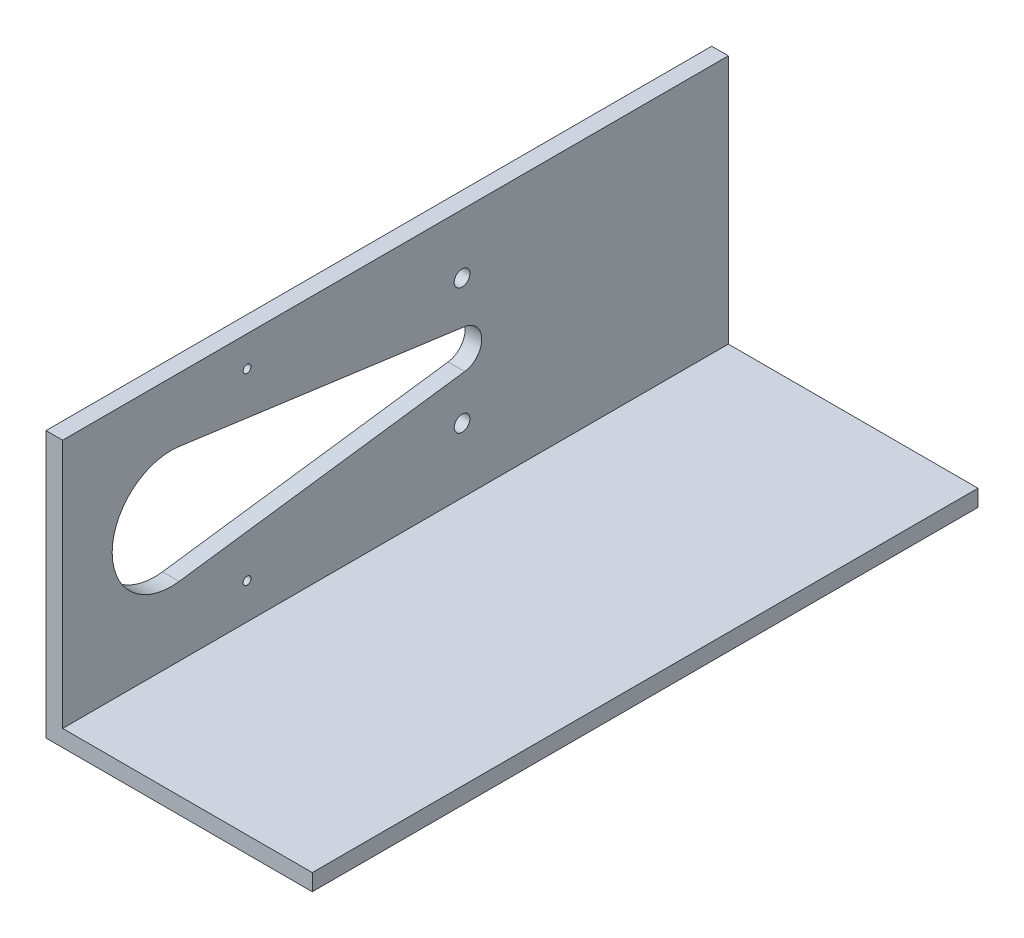
ISO-10303-21;
HEADER;
FILE_DESCRIPTION(('STEP AP214'),'2;1');
FILE_NAME('part.step','',(''),(''),'','','');
FILE_SCHEMA(('AUTOMOTIVE_DESIGN { 1 0 10303 214 1 1 1 1 }'));
ENDSEC;
DATA;
#1=APPLICATION_CONTEXT('core data for automotive mechanical design processes');
#2=APPLICATION_PROTOCOL_DEFINITION('international standard','automotive_design',2000,#1);
#3=PRODUCT_CONTEXT('',#1,'mechanical');
#4=PRODUCT('Part','Part','',(#3));
#5=PRODUCT_RELATED_PRODUCT_CATEGORY('part','',(#4));
#6=PRODUCT_DEFINITION_FORMATION('','',#4);
#7=PRODUCT_DEFINITION_CONTEXT('part definition',#1,'design');
#8=PRODUCT_DEFINITION('design','',#6,#7);
#9=PRODUCT_DEFINITION_SHAPE('','',#8);
#10=(LENGTH_UNIT() NAMED_UNIT(*) SI_UNIT(.MILLI.,.METRE.));
#11=(NAMED_UNIT(*) PLANE_ANGLE_UNIT() SI_UNIT($,.RADIAN.));
#12=(NAMED_UNIT(*) SI_UNIT($,.STERADIAN.) SOLID_ANGLE_UNIT());
#13=UNCERTAINTY_MEASURE_WITH_UNIT(LENGTH_MEASURE(1.E-05),#10,'distance_accuracy_value','');
#14=(GEOMETRIC_REPRESENTATION_CONTEXT(3) GLOBAL_UNCERTAINTY_ASSIGNED_CONTEXT((#13)) GLOBAL_UNIT_ASSIGNED_CONTEXT((#10,
#11,#12)) REPRESENTATION_CONTEXT('',''));
#15=CARTESIAN_POINT('',(0.,0.,0.));
#16=DIRECTION('',(0.,0.,1.));
#17=DIRECTION('',(1.,0.,0.));
#18=AXIS2_PLACEMENT_3D('',#15,#16,#17);
#19=CARTESIAN_POINT('',(0.,101.6,254.));
#20=DIRECTION('',(1.,0.,0.));
#21=DIRECTION('',(0.,1.,0.));
#22=AXIS2_PLACEMENT_3D('',#19,#20,#21);
#23=PLANE('',#22);
#24=CARTESIAN_POINT('',(0.,79.,101.6));
#25=DIRECTION('',(-1.,0.,0.));
#26=DIRECTION('',(0.,-1.,0.));
#27=AXIS2_PLACEMENT_3D('',#24,#25,#26);
#28=CIRCLE('',#27,3.00000000000001);
#29=CARTESIAN_POINT('',(0.,76.,101.6));
#30=VERTEX_POINT('',#29);
#31=EDGE_CURVE('E200',#30,#30,#28,.T.);
#32=ORIENTED_EDGE('',*,*,#31,.F.);
#33=EDGE_LOOP('',(#32));
#34=FACE_BOUND('',#33,.T.);
#35=CARTESIAN_POINT('',(0.,31.,101.6));
#36=DIRECTION('',(-1.,0.,0.));
#37=DIRECTION('',(0.,1.,0.));
#38=AXIS2_PLACEMENT_3D('',#35,#36,#37);
#39=CIRCLE('',#38,3.00000000000001);
#40=CARTESIAN_POINT('',(0.,34.,101.6));
#41=VERTEX_POINT('',#40);
#42=EDGE_CURVE('E206',#41,#41,#39,.T.);
#43=ORIENTED_EDGE('',*,*,#42,.F.);
#44=EDGE_LOOP('',(#43));
#45=FACE_BOUND('',#44,.T.);
#46=CARTESIAN_POINT('',(0.,90.,183.64));
#47=DIRECTION('',(-1.,0.,0.));
#48=DIRECTION('',(0.,-1.,0.));
#49=AXIS2_PLACEMENT_3D('',#46,#47,#48);
#50=CIRCLE('',#49,1.5);
#51=CARTESIAN_POINT('',(0.,88.5,183.64));
#52=VERTEX_POINT('',#51);
#53=EDGE_CURVE('E213',#52,#52,#50,.T.);
#54=ORIENTED_EDGE('',*,*,#53,.F.);
#55=EDGE_LOOP('',(#54));
#56=FACE_BOUND('',#55,.T.);
#57=DIRECTION('',(0.,-0.135135135135135,0.990827177287749));
#58=VECTOR('',#57,1.);
#59=CARTESIAN_POINT('',(0.,60.1682027622342,8.20611141629134));
#60=LINE('',#59,#58);
#61=CARTESIAN_POINT('',(0.,47.5687961703419,100.586486486486));
#62=VERTEX_POINT('',#61);
#63=CARTESIAN_POINT('',(0.,32.7063885110257,209.559459459459));
#64=VERTEX_POINT('',#63);
#65=EDGE_CURVE('E130',#62,#64,#60,.T.);
#66=ORIENTED_EDGE('',*,*,#65,.F.);
#67=CARTESIAN_POINT('',(0.,55.,101.6));
#68=DIRECTION('',(-1.,0.,0.));
#69=DIRECTION('',(0.,-1.,0.));
#70=AXIS2_PLACEMENT_3D('',#67,#68,#69);
#71=CIRCLE('',#70,7.50000000000001);
#72=CARTESIAN_POINT('',(0.,62.4312038296581,100.586486486486));
#73=VERTEX_POINT('',#72);
#74=EDGE_CURVE('E56',#73,#62,#71,.T.);
#75=ORIENTED_EDGE('',*,*,#74,.F.);
#76=DIRECTION('',(0.,0.135135135135135,0.990827177287749));
#77=VECTOR('',#76,1.);
#78=CARTESIAN_POINT('',(0.,47.8230317154868,-6.52240067852655));
#79=LINE('',#78,#77);
#80=CARTESIAN_POINT('',(0.,77.2936114889744,209.559459459459));
#81=VERTEX_POINT('',#80);
#82=EDGE_CURVE('E136',#73,#81,#79,.T.);
#83=ORIENTED_EDGE('',*,*,#82,.T.);
#84=CARTESIAN_POINT('',(0.,55.,212.6));
#85=DIRECTION('',(-1.,0.,0.));
#86=DIRECTION('',(0.,-1.,0.));
#87=AXIS2_PLACEMENT_3D('',#84,#85,#86);
#88=CIRCLE('',#87,22.5);
#89=EDGE_CURVE('E121',#64,#81,#88,.T.);
#90=ORIENTED_EDGE('',*,*,#89,.F.);
#91=EDGE_LOOP('',(#66,#75,#83,#90));
#92=FACE_BOUND('',#91,.T.);
#93=DIRECTION('',(0.,-1.,0.));
#94=VECTOR('',#93,1.);
#95=CARTESIAN_POINT('',(0.,101.6,0.));
#96=LINE('',#95,#94);
#97=CARTESIAN_POINT('',(0.,101.6,0.));
#98=VERTEX_POINT('',#97);
#99=CARTESIAN_POINT('',(0.,0.,0.));
#100=VERTEX_POINT('',#99);
#101=EDGE_CURVE('E164',#98,#100,#96,.T.);
#102=ORIENTED_EDGE('',*,*,#101,.T.);
#103=DIRECTION('',(0.,0.,-1.));
#104=VECTOR('',#103,1.);
#105=CARTESIAN_POINT('',(0.,0.,254.));
#106=LINE('',#105,#104);
#107=CARTESIAN_POINT('',(0.,0.,254.));
#108=VERTEX_POINT('',#107);
#109=EDGE_CURVE('E185',#108,#100,#106,.T.);
#110=ORIENTED_EDGE('',*,*,#109,.F.);
#111=DIRECTION('',(0.,-1.,0.));
#112=VECTOR('',#111,1.);
#113=CARTESIAN_POINT('',(0.,101.6,254.));
#114=LINE('',#113,#112);
#115=CARTESIAN_POINT('',(0.,101.6,254.));
#116=VERTEX_POINT('',#115);
#117=EDGE_CURVE('E149',#116,#108,#114,.T.);
#118=ORIENTED_EDGE('',*,*,#117,.F.);
#119=DIRECTION('',(0.,0.,-1.));
#120=VECTOR('',#119,1.);
#121=CARTESIAN_POINT('',(0.,101.6,254.));
#122=LINE('',#121,#120);
#123=EDGE_CURVE('E188',#116,#98,#122,.T.);
#124=ORIENTED_EDGE('',*,*,#123,.T.);
#125=EDGE_LOOP('',(#102,#110,#118,#124));
#126=FACE_BOUND('',#125,.T.);
#127=CARTESIAN_POINT('',(0.,20.,183.64));
#128=DIRECTION('',(-1.,0.,0.));
#129=DIRECTION('',(0.,-1.,0.));
#130=AXIS2_PLACEMENT_3D('',#127,#128,#129);
#131=CIRCLE('',#130,1.5);
#132=CARTESIAN_POINT('',(0.,18.5,183.64));
#133=VERTEX_POINT('',#132);
#134=EDGE_CURVE('E204',#133,#133,#131,.F.);
#135=ORIENTED_EDGE('',*,*,#134,.T.);
#136=EDGE_LOOP('',(#135));
#137=FACE_BOUND('',#136,.T.);
#138=ADVANCED_FACE('F39',(#34,#45,#56,#92,#126,#137),#23,.F.);
#139=CARTESIAN_POINT('',(6.35,6.34999999999999,254.));
#140=DIRECTION('',(-1.,0.,0.));
#141=DIRECTION('',(0.,-1.,0.));
#142=AXIS2_PLACEMENT_3D('',#139,#140,#141);
#143=PLANE('',#142);
#144=CARTESIAN_POINT('',(6.34999999999999,79.,101.6));
#145=DIRECTION('',(-1.,0.,0.));
#146=DIRECTION('',(0.,-1.,0.));
#147=AXIS2_PLACEMENT_3D('',#144,#145,#146);
#148=CIRCLE('',#147,3.00000000000001);
#149=CARTESIAN_POINT('',(6.34999999999999,76.,101.6));
#150=VERTEX_POINT('',#149);
#151=EDGE_CURVE('E43',#150,#150,#148,.T.);
#152=ORIENTED_EDGE('',*,*,#151,.T.);
#153=EDGE_LOOP('',(#152));
#154=FACE_BOUND('',#153,.T.);
#155=CARTESIAN_POINT('',(6.34999999999999,31.,101.6));
#156=DIRECTION('',(-1.,0.,0.));
#157=DIRECTION('',(0.,-1.,0.));
#158=AXIS2_PLACEMENT_3D('',#155,#156,#157);
#159=CIRCLE('',#158,3.00000000000001);
#160=CARTESIAN_POINT('',(6.34999999999999,28.,101.6));
#161=VERTEX_POINT('',#160);
#162=EDGE_CURVE('E198',#161,#161,#159,.T.);
#163=ORIENTED_EDGE('',*,*,#162,.T.);
#164=EDGE_LOOP('',(#163));
#165=FACE_BOUND('',#164,.T.);
#166=CARTESIAN_POINT('',(6.34999999999999,90.,183.64));
#167=DIRECTION('',(-1.,0.,0.));
#168=DIRECTION('',(0.,-1.,0.));
#169=AXIS2_PLACEMENT_3D('',#166,#167,#168);
#170=CIRCLE('',#169,1.5);
#171=CARTESIAN_POINT('',(6.34999999999999,88.5,183.64));
#172=VERTEX_POINT('',#171);
#173=EDGE_CURVE('E143',#172,#172,#170,.T.);
#174=ORIENTED_EDGE('',*,*,#173,.T.);
#175=EDGE_LOOP('',(#174));
#176=FACE_BOUND('',#175,.T.);
#177=DIRECTION('',(0.,0.135135135135135,0.990827177287749));
#178=VECTOR('',#177,1.);
#179=CARTESIAN_POINT('',(6.35,81.9484656532161,243.689413950048));
#180=LINE('',#179,#178);
#181=CARTESIAN_POINT('',(6.34999999999999,62.4312038296581,100.586486486486));
#182=VERTEX_POINT('',#181);
#183=CARTESIAN_POINT('',(6.34999999999999,77.2936114889744,209.559459459459));
#184=VERTEX_POINT('',#183);
#185=EDGE_CURVE('E48',#182,#184,#180,.T.);
#186=ORIENTED_EDGE('',*,*,#185,.F.);
#187=CARTESIAN_POINT('',(6.34999999999999,55.,101.6));
#188=DIRECTION('',(-1.,0.,0.));
#189=DIRECTION('',(0.,-1.,0.));
#190=AXIS2_PLACEMENT_3D('',#187,#188,#189);
#191=CIRCLE('',#190,7.50000000000001);
#192=CARTESIAN_POINT('',(6.34999999999999,47.5687961703419,100.586486486486));
#193=VERTEX_POINT('',#192);
#194=EDGE_CURVE('E11',#182,#193,#191,.T.);
#195=ORIENTED_EDGE('',*,*,#194,.T.);
#196=DIRECTION('',(0.,-0.135135135135135,0.990827177287749));
#197=VECTOR('',#196,1.);
#198=CARTESIAN_POINT('',(6.35,26.2746899348044,256.717452375737));
#199=LINE('',#198,#197);
#200=CARTESIAN_POINT('',(6.35,32.7063885110256,209.559459459459));
#201=VERTEX_POINT('',#200);
#202=EDGE_CURVE('E191',#193,#201,#199,.T.);
#203=ORIENTED_EDGE('',*,*,#202,.T.);
#204=CARTESIAN_POINT('',(6.34999999999999,55.,212.6));
#205=DIRECTION('',(-1.,0.,0.));
#206=DIRECTION('',(0.,-1.,0.));
#207=AXIS2_PLACEMENT_3D('',#204,#205,#206);
#208=CIRCLE('',#207,22.5);
#209=EDGE_CURVE('E124',#201,#184,#208,.T.);
#210=ORIENTED_EDGE('',*,*,#209,.T.);
#211=EDGE_LOOP('',(#186,#195,#203,#210));
#212=FACE_BOUND('',#211,.T.);
#213=DIRECTION('',(0.,1.,0.));
#214=VECTOR('',#213,1.);
#215=CARTESIAN_POINT('',(6.35,6.34999999999999,0.));
#216=LINE('',#215,#214);
#217=CARTESIAN_POINT('',(6.35,6.34999999999999,0.));
#218=VERTEX_POINT('',#217);
#219=CARTESIAN_POINT('',(6.35000000000001,101.6,0.));
#220=VERTEX_POINT('',#219);
#221=EDGE_CURVE('E150',#218,#220,#216,.T.);
#222=ORIENTED_EDGE('',*,*,#221,.T.);
#223=DIRECTION('',(0.,0.,-1.));
#224=VECTOR('',#223,1.);
#225=CARTESIAN_POINT('',(6.35000000000001,101.6,254.));
#226=LINE('',#225,#224);
#227=CARTESIAN_POINT('',(6.35000000000001,101.6,254.));
#228=VERTEX_POINT('',#227);
#229=EDGE_CURVE('E160',#228,#220,#226,.T.);
#230=ORIENTED_EDGE('',*,*,#229,.F.);
#231=DIRECTION('',(0.,1.,0.));
#232=VECTOR('',#231,1.);
#233=CARTESIAN_POINT('',(6.35,6.34999999999999,254.));
#234=LINE('',#233,#232);
#235=CARTESIAN_POINT('',(6.35,6.34999999999999,254.));
#236=VERTEX_POINT('',#235);
#237=EDGE_CURVE('E158',#236,#228,#234,.T.);
#238=ORIENTED_EDGE('',*,*,#237,.F.);
#239=DIRECTION('',(0.,0.,-1.));
#240=VECTOR('',#239,1.);
#241=CARTESIAN_POINT('',(6.35,6.34999999999999,254.));
#242=LINE('',#241,#240);
#243=EDGE_CURVE('E176',#236,#218,#242,.T.);
#244=ORIENTED_EDGE('',*,*,#243,.T.);
#245=EDGE_LOOP('',(#222,#230,#238,#244));
#246=FACE_BOUND('',#245,.T.);
#247=CARTESIAN_POINT('',(6.34999999999999,20.,183.64));
#248=DIRECTION('',(-1.,0.,0.));
#249=DIRECTION('',(0.,-1.,0.));
#250=AXIS2_PLACEMENT_3D('',#247,#248,#249);
#251=CIRCLE('',#250,1.5);
#252=CARTESIAN_POINT('',(6.34999999999999,18.5,183.64));
#253=VERTEX_POINT('',#252);
#254=EDGE_CURVE('E165',#253,#253,#251,.F.);
#255=ORIENTED_EDGE('',*,*,#254,.F.);
#256=EDGE_LOOP('',(#255));
#257=FACE_BOUND('',#256,.T.);
#258=ADVANCED_FACE('F228',(#154,#165,#176,#212,#246,#257),#143,.F.);
#259=CARTESIAN_POINT('',(6.35000000000001,101.6,254.));
#260=DIRECTION('',(0.,-1.,0.));
#261=DIRECTION('',(0.,0.,-1.));
#262=AXIS2_PLACEMENT_3D('',#259,#260,#261);
#263=PLANE('',#262);
#264=DIRECTION('',(-1.,0.,0.));
#265=VECTOR('',#264,1.);
#266=CARTESIAN_POINT('',(6.35000000000001,101.6,0.));
#267=LINE('',#266,#265);
#268=EDGE_CURVE('E161',#220,#98,#267,.T.);
#269=ORIENTED_EDGE('',*,*,#268,.T.);
#270=ORIENTED_EDGE('',*,*,#123,.F.);
#271=DIRECTION('',(-1.,0.,0.));
#272=VECTOR('',#271,1.);
#273=CARTESIAN_POINT('',(6.35000000000001,101.6,254.));
#274=LINE('',#273,#272);
#275=EDGE_CURVE('E146',#228,#116,#274,.T.);
#276=ORIENTED_EDGE('',*,*,#275,.F.);
#277=ORIENTED_EDGE('',*,*,#229,.T.);
#278=EDGE_LOOP('',(#269,#270,#276,#277));
#279=FACE_BOUND('',#278,.T.);
#280=ADVANCED_FACE('F41',(#279),#263,.F.);
#281=CARTESIAN_POINT('',(0.,0.,254.));
#282=DIRECTION('',(0.,1.,0.));
#283=DIRECTION('',(0.,0.,1.));
#284=AXIS2_PLACEMENT_3D('',#281,#282,#283);
#285=PLANE('',#284);
#286=DIRECTION('',(1.,0.,0.));
#287=VECTOR('',#286,1.);
#288=CARTESIAN_POINT('',(0.,0.,0.));
#289=LINE('',#288,#287);
#290=CARTESIAN_POINT('',(101.6,0.,0.));
#291=VERTEX_POINT('',#290);
#292=EDGE_CURVE('E167',#100,#291,#289,.T.);
#293=ORIENTED_EDGE('',*,*,#292,.T.);
#294=DIRECTION('',(0.,0.,-1.));
#295=VECTOR('',#294,1.);
#296=CARTESIAN_POINT('',(101.6,0.,254.));
#297=LINE('',#296,#295);
#298=CARTESIAN_POINT('',(101.6,0.,254.));
#299=VERTEX_POINT('',#298);
#300=EDGE_CURVE('E182',#299,#291,#297,.T.);
#301=ORIENTED_EDGE('',*,*,#300,.F.);
#302=DIRECTION('',(1.,0.,0.));
#303=VECTOR('',#302,1.);
#304=CARTESIAN_POINT('',(0.,0.,254.));
#305=LINE('',#304,#303);
#306=EDGE_CURVE('E152',#108,#299,#305,.T.);
#307=ORIENTED_EDGE('',*,*,#306,.F.);
#308=ORIENTED_EDGE('',*,*,#109,.T.);
#309=EDGE_LOOP('',(#293,#301,#307,#308));
#310=FACE_BOUND('',#309,.T.);
#311=ADVANCED_FACE('F237',(#310),#285,.F.);
#312=CARTESIAN_POINT('',(101.6,0.,254.));
#313=DIRECTION('',(-1.,0.,0.));
#314=DIRECTION('',(0.,0.,1.));
#315=AXIS2_PLACEMENT_3D('',#312,#313,#314);
#316=PLANE('',#315);
#317=DIRECTION('',(0.,1.,0.));
#318=VECTOR('',#317,1.);
#319=CARTESIAN_POINT('',(101.6,0.,0.));
#320=LINE('',#319,#318);
#321=CARTESIAN_POINT('',(101.6,6.35,0.));
#322=VERTEX_POINT('',#321);
#323=EDGE_CURVE('E169',#291,#322,#320,.T.);
#324=ORIENTED_EDGE('',*,*,#323,.T.);
#325=DIRECTION('',(0.,0.,-1.));
#326=VECTOR('',#325,1.);
#327=CARTESIAN_POINT('',(101.6,6.35,254.));
#328=LINE('',#327,#326);
#329=CARTESIAN_POINT('',(101.6,6.35,254.));
#330=VERTEX_POINT('',#329);
#331=EDGE_CURVE('E179',#330,#322,#328,.T.);
#332=ORIENTED_EDGE('',*,*,#331,.F.);
#333=DIRECTION('',(0.,1.,0.));
#334=VECTOR('',#333,1.);
#335=CARTESIAN_POINT('',(101.6,0.,254.));
#336=LINE('',#335,#334);
#337=EDGE_CURVE('E154',#299,#330,#336,.T.);
#338=ORIENTED_EDGE('',*,*,#337,.F.);
#339=ORIENTED_EDGE('',*,*,#300,.T.);
#340=EDGE_LOOP('',(#324,#332,#338,#339));
#341=FACE_BOUND('',#340,.T.);
#342=ADVANCED_FACE('F248',(#341),#316,.F.);
#343=CARTESIAN_POINT('',(101.6,6.35,254.));
#344=DIRECTION('',(0.,-1.,0.));
#345=DIRECTION('',(1.,0.,0.));
#346=AXIS2_PLACEMENT_3D('',#343,#344,#345);
#347=PLANE('',#346);
#348=DIRECTION('',(-1.,0.,0.));
#349=VECTOR('',#348,1.);
#350=CARTESIAN_POINT('',(101.6,6.35,0.));
#351=LINE('',#350,#349);
#352=EDGE_CURVE('E171',#322,#218,#351,.T.);
#353=ORIENTED_EDGE('',*,*,#352,.T.);
#354=ORIENTED_EDGE('',*,*,#243,.F.);
#355=DIRECTION('',(-1.,0.,0.));
#356=VECTOR('',#355,1.);
#357=CARTESIAN_POINT('',(101.6,6.35,254.));
#358=LINE('',#357,#356);
#359=EDGE_CURVE('E156',#330,#236,#358,.T.);
#360=ORIENTED_EDGE('',*,*,#359,.F.);
#361=ORIENTED_EDGE('',*,*,#331,.T.);
#362=EDGE_LOOP('',(#353,#354,#360,#361));
#363=FACE_BOUND('',#362,.T.);
#364=ADVANCED_FACE('F244',(#363),#347,.F.);
#365=CARTESIAN_POINT('',(0.,0.,254.));
#366=DIRECTION('',(0.,0.,1.));
#367=DIRECTION('',(1.,0.,0.));
#368=AXIS2_PLACEMENT_3D('',#365,#366,#367);
#369=PLANE('',#368);
#370=ORIENTED_EDGE('',*,*,#275,.T.);
#371=ORIENTED_EDGE('',*,*,#117,.T.);
#372=ORIENTED_EDGE('',*,*,#306,.T.);
#373=ORIENTED_EDGE('',*,*,#337,.T.);
#374=ORIENTED_EDGE('',*,*,#359,.T.);
#375=ORIENTED_EDGE('',*,*,#237,.T.);
#376=EDGE_LOOP('',(#370,#371,#372,#373,#374,#375));
#377=FACE_BOUND('',#376,.T.);
#378=ADVANCED_FACE('F247',(#377),#369,.T.);
#379=CARTESIAN_POINT('',(0.,0.,0.));
#380=DIRECTION('',(0.,0.,1.));
#381=DIRECTION('',(1.,0.,0.));
#382=AXIS2_PLACEMENT_3D('',#379,#380,#381);
#383=PLANE('',#382);
#384=ORIENTED_EDGE('',*,*,#268,.F.);
#385=ORIENTED_EDGE('',*,*,#221,.F.);
#386=ORIENTED_EDGE('',*,*,#352,.F.);
#387=ORIENTED_EDGE('',*,*,#323,.F.);
#388=ORIENTED_EDGE('',*,*,#292,.F.);
#389=ORIENTED_EDGE('',*,*,#101,.F.);
#390=EDGE_LOOP('',(#384,#385,#386,#387,#388,#389));
#391=FACE_BOUND('',#390,.T.);
#392=ADVANCED_FACE('F242',(#391),#383,.F.);
#393=CARTESIAN_POINT('',(254.,55.,101.6));
#394=DIRECTION('',(-1.,0.,0.));
#395=DIRECTION('',(0.,-1.,0.));
#396=AXIS2_PLACEMENT_3D('',#393,#394,#395);
#397=CYLINDRICAL_SURFACE('',#396,7.50000000000001);
#398=DIRECTION('',(-1.,0.,0.));
#399=VECTOR('',#398,1.);
#400=CARTESIAN_POINT('',(254.,62.4312038296582,100.586486486486));
#401=LINE('',#400,#399);
#402=EDGE_CURVE('E141',#182,#73,#401,.T.);
#403=ORIENTED_EDGE('',*,*,#402,.T.);
#404=ORIENTED_EDGE('',*,*,#74,.T.);
#405=DIRECTION('',(-1.,0.,0.));
#406=VECTOR('',#405,1.);
#407=CARTESIAN_POINT('',(254.,47.5687961703419,100.586486486486));
#408=LINE('',#407,#406);
#409=EDGE_CURVE('E127',#193,#62,#408,.T.);
#410=ORIENTED_EDGE('',*,*,#409,.F.);
#411=ORIENTED_EDGE('',*,*,#194,.F.);
#412=EDGE_LOOP('',(#403,#404,#410,#411));
#413=FACE_BOUND('',#412,.T.);
#414=ADVANCED_FACE('F280',(#413),#397,.F.);
#415=CARTESIAN_POINT('',(254.,47.8230317154868,-6.52240067852655));
#416=DIRECTION('',(0.,-0.990827177287749,0.135135135135135));
#417=DIRECTION('',(0.,-0.135135135135135,-0.990827177287749));
#418=AXIS2_PLACEMENT_3D('',#415,#416,#417);
#419=PLANE('',#418);
#420=ORIENTED_EDGE('',*,*,#185,.T.);
#421=DIRECTION('',(-1.,0.,0.));
#422=VECTOR('',#421,1.);
#423=CARTESIAN_POINT('',(254.,77.2936114889744,209.559459459459));
#424=LINE('',#423,#422);
#425=EDGE_CURVE('E126',#184,#81,#424,.T.);
#426=ORIENTED_EDGE('',*,*,#425,.T.);
#427=ORIENTED_EDGE('',*,*,#82,.F.);
#428=ORIENTED_EDGE('',*,*,#402,.F.);
#429=EDGE_LOOP('',(#420,#426,#427,#428));
#430=FACE_BOUND('',#429,.T.);
#431=ADVANCED_FACE('F284',(#430),#419,.T.);
#432=CARTESIAN_POINT('',(254.,55.,212.6));
#433=DIRECTION('',(-1.,0.,0.));
#434=DIRECTION('',(0.,-1.,0.));
#435=AXIS2_PLACEMENT_3D('',#432,#433,#434);
#436=CYLINDRICAL_SURFACE('',#435,22.5);
#437=DIRECTION('',(-1.,0.,0.));
#438=VECTOR('',#437,1.);
#439=CARTESIAN_POINT('',(254.,32.7063885110257,209.559459459459));
#440=LINE('',#439,#438);
#441=EDGE_CURVE('E64',#201,#64,#440,.T.);
#442=ORIENTED_EDGE('',*,*,#441,.T.);
#443=ORIENTED_EDGE('',*,*,#89,.T.);
#444=ORIENTED_EDGE('',*,*,#425,.F.);
#445=ORIENTED_EDGE('',*,*,#209,.F.);
#446=EDGE_LOOP('',(#442,#443,#444,#445));
#447=FACE_BOUND('',#446,.T.);
#448=ADVANCED_FACE('F118',(#447),#436,.F.);
#449=CARTESIAN_POINT('',(254.,60.1682027622342,8.20611141629134));
#450=DIRECTION('',(0.,-0.990827177287749,-0.135135135135135));
#451=DIRECTION('',(0.,0.135135135135135,-0.990827177287749));
#452=AXIS2_PLACEMENT_3D('',#449,#450,#451);
#453=PLANE('',#452);
#454=ORIENTED_EDGE('',*,*,#409,.T.);
#455=ORIENTED_EDGE('',*,*,#65,.T.);
#456=ORIENTED_EDGE('',*,*,#441,.F.);
#457=ORIENTED_EDGE('',*,*,#202,.F.);
#458=EDGE_LOOP('',(#454,#455,#456,#457));
#459=FACE_BOUND('',#458,.T.);
#460=ADVANCED_FACE('F131',(#459),#453,.F.);
#461=CARTESIAN_POINT('',(254.,90.,183.64));
#462=DIRECTION('',(-1.,0.,0.));
#463=DIRECTION('',(0.,-1.,0.));
#464=AXIS2_PLACEMENT_3D('',#461,#462,#463);
#465=CYLINDRICAL_SURFACE('',#464,1.5);
#466=ORIENTED_EDGE('',*,*,#53,.T.);
#467=EDGE_LOOP('',(#466));
#468=FACE_BOUND('',#467,.T.);
#469=ORIENTED_EDGE('',*,*,#173,.F.);
#470=EDGE_LOOP('',(#469));
#471=FACE_BOUND('',#470,.T.);
#472=ADVANCED_FACE('F224',(#468,#471),#465,.F.);
#473=CARTESIAN_POINT('',(254.,20.,183.64));
#474=DIRECTION('',(-1.,0.,0.));
#475=DIRECTION('',(0.,-1.,0.));
#476=AXIS2_PLACEMENT_3D('',#473,#474,#475);
#477=CYLINDRICAL_SURFACE('',#476,1.5);
#478=ORIENTED_EDGE('',*,*,#134,.F.);
#479=EDGE_LOOP('',(#478));
#480=FACE_BOUND('',#479,.T.);
#481=ORIENTED_EDGE('',*,*,#254,.T.);
#482=EDGE_LOOP('',(#481));
#483=FACE_BOUND('',#482,.T.);
#484=ADVANCED_FACE('F220',(#480,#483),#477,.F.);
#485=CARTESIAN_POINT('',(101.6,31.,101.6));
#486=DIRECTION('',(-1.,0.,0.));
#487=DIRECTION('',(0.,-1.,0.));
#488=AXIS2_PLACEMENT_3D('',#485,#486,#487);
#489=CYLINDRICAL_SURFACE('',#488,3.00000000000001);
#490=ORIENTED_EDGE('',*,*,#42,.T.);
#491=EDGE_LOOP('',(#490));
#492=FACE_BOUND('',#491,.T.);
#493=ORIENTED_EDGE('',*,*,#162,.F.);
#494=EDGE_LOOP('',(#493));
#495=FACE_BOUND('',#494,.T.);
#496=ADVANCED_FACE('F223',(#492,#495),#489,.F.);
#497=CARTESIAN_POINT('',(101.6,79.,101.6));
#498=DIRECTION('',(-1.,0.,0.));
#499=DIRECTION('',(0.,-1.,0.));
#500=AXIS2_PLACEMENT_3D('',#497,#498,#499);
#501=CYLINDRICAL_SURFACE('',#500,3.00000000000001);
#502=ORIENTED_EDGE('',*,*,#31,.T.);
#503=EDGE_LOOP('',(#502));
#504=FACE_BOUND('',#503,.T.);
#505=ORIENTED_EDGE('',*,*,#151,.F.);
#506=EDGE_LOOP('',(#505));
#507=FACE_BOUND('',#506,.T.);
#508=ADVANCED_FACE('F296',(#504,#507),#501,.F.);
#509=CLOSED_SHELL('',(#138,#258,#280,#311,#342,#364,#378,#392,#414,#431,#448,#460,#472,#484,
#496,#508));
#510=MANIFOLD_SOLID_BREP('B2',#509);
#511=ADVANCED_BREP_SHAPE_REPRESENTATION('',(#18,#510),#14);
#512=SHAPE_DEFINITION_REPRESENTATION(#9,#511);
ENDSEC;
END-ISO-10303-21;
